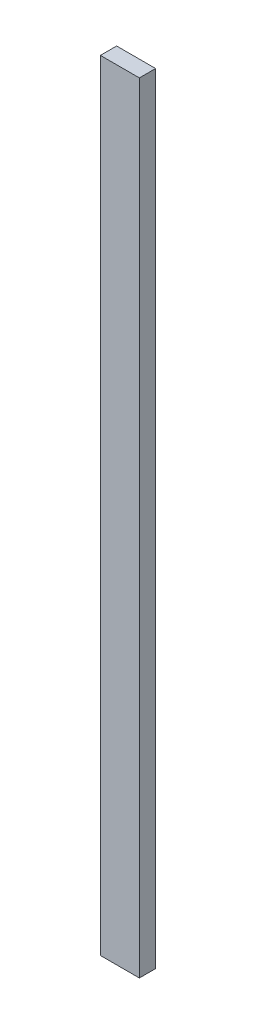
ISO-10303-21;
HEADER;
FILE_DESCRIPTION(('STEP AP214'),'2;1');
FILE_NAME('part.step','',(''),(''),'','','');
FILE_SCHEMA(('AUTOMOTIVE_DESIGN { 1 0 10303 214 1 1 1 1 }'));
ENDSEC;
DATA;
#1=APPLICATION_CONTEXT('core data for automotive mechanical design processes');
#2=APPLICATION_PROTOCOL_DEFINITION('international standard','automotive_design',2000,#1);
#3=PRODUCT_CONTEXT('',#1,'mechanical');
#4=PRODUCT('Part','Part','',(#3));
#5=PRODUCT_RELATED_PRODUCT_CATEGORY('part','',(#4));
#6=PRODUCT_DEFINITION_FORMATION('','',#4);
#7=PRODUCT_DEFINITION_CONTEXT('part definition',#1,'design');
#8=PRODUCT_DEFINITION('design','',#6,#7);
#9=PRODUCT_DEFINITION_SHAPE('','',#8);
#10=(LENGTH_UNIT() NAMED_UNIT(*) SI_UNIT(.MILLI.,.METRE.));
#11=(NAMED_UNIT(*) PLANE_ANGLE_UNIT() SI_UNIT($,.RADIAN.));
#12=(NAMED_UNIT(*) SI_UNIT($,.STERADIAN.) SOLID_ANGLE_UNIT());
#13=UNCERTAINTY_MEASURE_WITH_UNIT(LENGTH_MEASURE(1.E-05),#10,'distance_accuracy_value','');
#14=(GEOMETRIC_REPRESENTATION_CONTEXT(3) GLOBAL_UNCERTAINTY_ASSIGNED_CONTEXT((#13)) GLOBAL_UNIT_ASSIGNED_CONTEXT((#10,
#11,#12)) REPRESENTATION_CONTEXT('',''));
#15=CARTESIAN_POINT('',(0.,0.,0.));
#16=DIRECTION('',(0.,0.,1.));
#17=DIRECTION('',(1.,0.,0.));
#18=AXIS2_PLACEMENT_3D('',#15,#16,#17);
#19=CARTESIAN_POINT('',(0.,0.,25.));
#20=DIRECTION('',(1.,0.,0.));
#21=DIRECTION('',(0.,0.,-1.));
#22=AXIS2_PLACEMENT_3D('',#19,#20,#21);
#23=PLANE('',#22);
#24=DIRECTION('',(0.,-1.,0.));
#25=VECTOR('',#24,1.);
#26=CARTESIAN_POINT('',(0.,0.,0.));
#27=LINE('',#26,#25);
#28=CARTESIAN_POINT('',(0.,1200.,0.));
#29=VERTEX_POINT('',#28);
#30=CARTESIAN_POINT('',(0.,0.,0.));
#31=VERTEX_POINT('',#30);
#32=EDGE_CURVE('E95',#29,#31,#27,.T.);
#33=ORIENTED_EDGE('',*,*,#32,.T.);
#34=DIRECTION('',(0.,0.,-1.));
#35=VECTOR('',#34,1.);
#36=CARTESIAN_POINT('',(0.,0.,25.));
#37=LINE('',#36,#35);
#38=CARTESIAN_POINT('',(0.,0.,25.));
#39=VERTEX_POINT('',#38);
#40=EDGE_CURVE('E11',#39,#31,#37,.T.);
#41=ORIENTED_EDGE('',*,*,#40,.F.);
#42=DIRECTION('',(0.,-1.,0.));
#43=VECTOR('',#42,1.);
#44=CARTESIAN_POINT('',(0.,0.,25.));
#45=LINE('',#44,#43);
#46=CARTESIAN_POINT('',(0.,1200.,25.));
#47=VERTEX_POINT('',#46);
#48=EDGE_CURVE('E83',#47,#39,#45,.T.);
#49=ORIENTED_EDGE('',*,*,#48,.F.);
#50=DIRECTION('',(0.,0.,-1.));
#51=VECTOR('',#50,1.);
#52=CARTESIAN_POINT('',(0.,1200.,25.));
#53=LINE('',#52,#51);
#54=EDGE_CURVE('E91',#47,#29,#53,.T.);
#55=ORIENTED_EDGE('',*,*,#54,.T.);
#56=EDGE_LOOP('',(#33,#41,#49,#55));
#57=FACE_BOUND('',#56,.T.);
#58=ADVANCED_FACE('F32',(#57),#23,.F.);
#59=CARTESIAN_POINT('',(0.,0.,25.));
#60=DIRECTION('',(0.,1.,0.));
#61=DIRECTION('',(0.,0.,1.));
#62=AXIS2_PLACEMENT_3D('',#59,#60,#61);
#63=PLANE('',#62);
#64=DIRECTION('',(1.,0.,0.));
#65=VECTOR('',#64,1.);
#66=CARTESIAN_POINT('',(0.,0.,0.));
#67=LINE('',#66,#65);
#68=CARTESIAN_POINT('',(60.,0.,0.));
#69=VERTEX_POINT('',#68);
#70=EDGE_CURVE('E87',#31,#69,#67,.T.);
#71=ORIENTED_EDGE('',*,*,#70,.T.);
#72=DIRECTION('',(0.,0.,-1.));
#73=VECTOR('',#72,1.);
#74=CARTESIAN_POINT('',(60.,0.,25.));
#75=LINE('',#74,#73);
#76=CARTESIAN_POINT('',(60.,0.,25.));
#77=VERTEX_POINT('',#76);
#78=EDGE_CURVE('E40',#77,#69,#75,.T.);
#79=ORIENTED_EDGE('',*,*,#78,.F.);
#80=DIRECTION('',(1.,0.,0.));
#81=VECTOR('',#80,1.);
#82=CARTESIAN_POINT('',(0.,0.,25.));
#83=LINE('',#82,#81);
#84=EDGE_CURVE('E78',#39,#77,#83,.T.);
#85=ORIENTED_EDGE('',*,*,#84,.F.);
#86=ORIENTED_EDGE('',*,*,#40,.T.);
#87=EDGE_LOOP('',(#71,#79,#85,#86));
#88=FACE_BOUND('',#87,.T.);
#89=ADVANCED_FACE('F86',(#88),#63,.F.);
#90=CARTESIAN_POINT('',(60.,0.,25.));
#91=DIRECTION('',(-1.,0.,0.));
#92=DIRECTION('',(0.,0.,1.));
#93=AXIS2_PLACEMENT_3D('',#90,#91,#92);
#94=PLANE('',#93);
#95=DIRECTION('',(0.,1.,0.));
#96=VECTOR('',#95,1.);
#97=CARTESIAN_POINT('',(60.,0.,0.));
#98=LINE('',#97,#96);
#99=CARTESIAN_POINT('',(60.,1200.,0.));
#100=VERTEX_POINT('',#99);
#101=EDGE_CURVE('E65',#69,#100,#98,.T.);
#102=ORIENTED_EDGE('',*,*,#101,.T.);
#103=DIRECTION('',(0.,0.,-1.));
#104=VECTOR('',#103,1.);
#105=CARTESIAN_POINT('',(60.,1200.,25.));
#106=LINE('',#105,#104);
#107=CARTESIAN_POINT('',(60.,1200.,25.));
#108=VERTEX_POINT('',#107);
#109=EDGE_CURVE('E88',#108,#100,#106,.T.);
#110=ORIENTED_EDGE('',*,*,#109,.F.);
#111=DIRECTION('',(0.,1.,0.));
#112=VECTOR('',#111,1.);
#113=CARTESIAN_POINT('',(60.,0.,25.));
#114=LINE('',#113,#112);
#115=EDGE_CURVE('E81',#77,#108,#114,.T.);
#116=ORIENTED_EDGE('',*,*,#115,.F.);
#117=ORIENTED_EDGE('',*,*,#78,.T.);
#118=EDGE_LOOP('',(#102,#110,#116,#117));
#119=FACE_BOUND('',#118,.T.);
#120=ADVANCED_FACE('F89',(#119),#94,.F.);
#121=CARTESIAN_POINT('',(0.,1200.,25.));
#122=DIRECTION('',(0.,-1.,0.));
#123=DIRECTION('',(0.,0.,-1.));
#124=AXIS2_PLACEMENT_3D('',#121,#122,#123);
#125=PLANE('',#124);
#126=DIRECTION('',(-1.,0.,0.));
#127=VECTOR('',#126,1.);
#128=CARTESIAN_POINT('',(0.,1200.,0.));
#129=LINE('',#128,#127);
#130=EDGE_CURVE('E71',#100,#29,#129,.T.);
#131=ORIENTED_EDGE('',*,*,#130,.T.);
#132=ORIENTED_EDGE('',*,*,#54,.F.);
#133=DIRECTION('',(-1.,0.,0.));
#134=VECTOR('',#133,1.);
#135=CARTESIAN_POINT('',(0.,1200.,25.));
#136=LINE('',#135,#134);
#137=EDGE_CURVE('E48',#108,#47,#136,.T.);
#138=ORIENTED_EDGE('',*,*,#137,.F.);
#139=ORIENTED_EDGE('',*,*,#109,.T.);
#140=EDGE_LOOP('',(#131,#132,#138,#139));
#141=FACE_BOUND('',#140,.T.);
#142=ADVANCED_FACE('F102',(#141),#125,.F.);
#143=CARTESIAN_POINT('',(0.,0.,25.));
#144=DIRECTION('',(0.,0.,-1.));
#145=DIRECTION('',(-1.,0.,0.));
#146=AXIS2_PLACEMENT_3D('',#143,#144,#145);
#147=PLANE('',#146);
#148=ORIENTED_EDGE('',*,*,#48,.T.);
#149=ORIENTED_EDGE('',*,*,#84,.T.);
#150=ORIENTED_EDGE('',*,*,#115,.T.);
#151=ORIENTED_EDGE('',*,*,#137,.T.);
#152=EDGE_LOOP('',(#148,#149,#150,#151));
#153=FACE_BOUND('',#152,.T.);
#154=ADVANCED_FACE('F79',(#153),#147,.F.);
#155=CARTESIAN_POINT('',(0.,0.,0.));
#156=DIRECTION('',(0.,0.,-1.));
#157=DIRECTION('',(-1.,0.,0.));
#158=AXIS2_PLACEMENT_3D('',#155,#156,#157);
#159=PLANE('',#158);
#160=ORIENTED_EDGE('',*,*,#32,.F.);
#161=ORIENTED_EDGE('',*,*,#130,.F.);
#162=ORIENTED_EDGE('',*,*,#101,.F.);
#163=ORIENTED_EDGE('',*,*,#70,.F.);
#164=EDGE_LOOP('',(#160,#161,#162,#163));
#165=FACE_BOUND('',#164,.T.);
#166=ADVANCED_FACE('F105',(#165),#159,.T.);
#167=CLOSED_SHELL('',(#58,#89,#120,#142,#154,#166));
#168=MANIFOLD_SOLID_BREP('B2',#167);
#169=ADVANCED_BREP_SHAPE_REPRESENTATION('',(#18,#168),#14);
#170=SHAPE_DEFINITION_REPRESENTATION(#9,#169);
ENDSEC;
END-ISO-10303-21;
